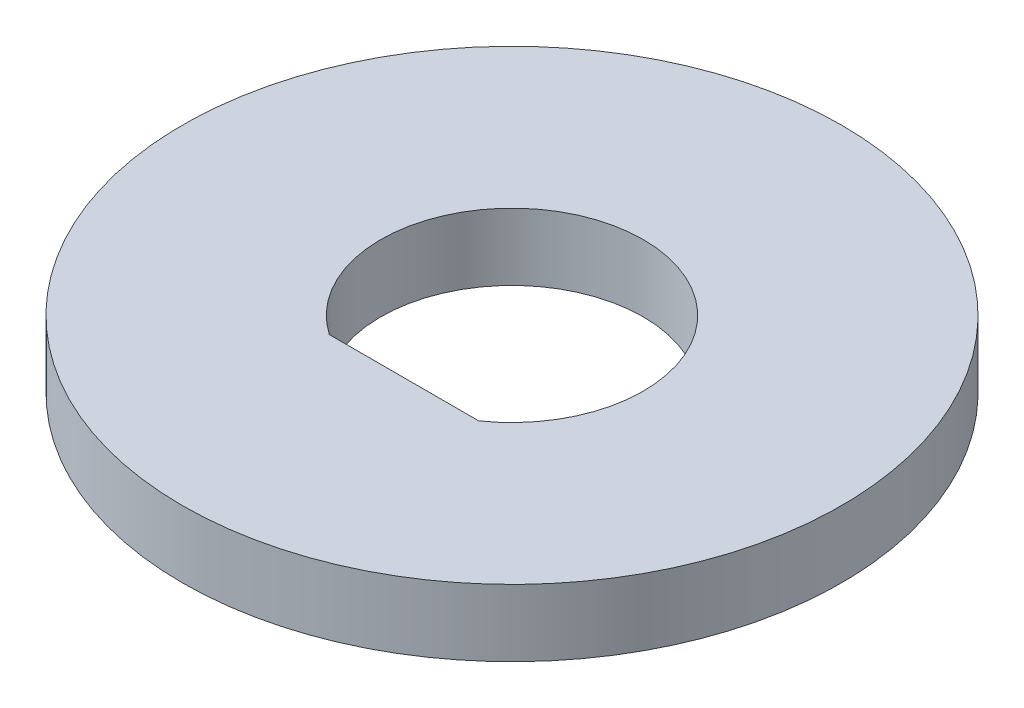
ISO-10303-21;
HEADER;
FILE_DESCRIPTION(('STEP AP214'),'2;1');
FILE_NAME('part.step','',(''),(''),'','','');
FILE_SCHEMA(('AUTOMOTIVE_DESIGN { 1 0 10303 214 1 1 1 1 }'));
ENDSEC;
DATA;
#1=APPLICATION_CONTEXT('core data for automotive mechanical design processes');
#2=APPLICATION_PROTOCOL_DEFINITION('international standard','automotive_design',2000,#1);
#3=PRODUCT_CONTEXT('',#1,'mechanical');
#4=PRODUCT('Part','Part','',(#3));
#5=PRODUCT_RELATED_PRODUCT_CATEGORY('part','',(#4));
#6=PRODUCT_DEFINITION_FORMATION('','',#4);
#7=PRODUCT_DEFINITION_CONTEXT('part definition',#1,'design');
#8=PRODUCT_DEFINITION('design','',#6,#7);
#9=PRODUCT_DEFINITION_SHAPE('','',#8);
#10=(LENGTH_UNIT() NAMED_UNIT(*) SI_UNIT(.MILLI.,.METRE.));
#11=(NAMED_UNIT(*) PLANE_ANGLE_UNIT() SI_UNIT($,.RADIAN.));
#12=(NAMED_UNIT(*) SI_UNIT($,.STERADIAN.) SOLID_ANGLE_UNIT());
#13=UNCERTAINTY_MEASURE_WITH_UNIT(LENGTH_MEASURE(1.E-05),#10,'distance_accuracy_value','');
#14=(GEOMETRIC_REPRESENTATION_CONTEXT(3) GLOBAL_UNCERTAINTY_ASSIGNED_CONTEXT((#13)) GLOBAL_UNIT_ASSIGNED_CONTEXT((#10,
#11,#12)) REPRESENTATION_CONTEXT('',''));
#15=CARTESIAN_POINT('',(0.,0.,0.));
#16=DIRECTION('',(0.,0.,1.));
#17=DIRECTION('',(1.,0.,0.));
#18=AXIS2_PLACEMENT_3D('',#15,#16,#17);
#19=CARTESIAN_POINT('',(0.,2.6,0.));
#20=DIRECTION('',(0.,1.,0.));
#21=DIRECTION('',(0.,0.,1.));
#22=AXIS2_PLACEMENT_3D('',#19,#20,#21);
#23=PLANE('',#22);
#24=CARTESIAN_POINT('',(0.,2.6,0.));
#25=DIRECTION('',(0.,1.,0.));
#26=DIRECTION('',(0.,0.,1.));
#27=AXIS2_PLACEMENT_3D('',#24,#25,#26);
#28=CIRCLE('',#27,12.8);
#29=CARTESIAN_POINT('',(0.,2.6,12.8));
#30=VERTEX_POINT('',#29);
#31=EDGE_CURVE('E11',#30,#30,#28,.T.);
#32=ORIENTED_EDGE('',*,*,#31,.T.);
#33=EDGE_LOOP('',(#32));
#34=FACE_BOUND('',#33,.T.);
#35=DIRECTION('',(1.,0.,0.));
#36=VECTOR('',#35,1.);
#37=CARTESIAN_POINT('',(-2.9,2.6,4.19523539268061));
#38=LINE('',#37,#36);
#39=CARTESIAN_POINT('',(-2.9,2.6,4.19523539268061));
#40=VERTEX_POINT('',#39);
#41=CARTESIAN_POINT('',(2.9,2.6,4.19523539268061));
#42=VERTEX_POINT('',#41);
#43=EDGE_CURVE('E84',#40,#42,#38,.T.);
#44=ORIENTED_EDGE('',*,*,#43,.F.);
#45=CARTESIAN_POINT('',(0.,2.6,0.));
#46=DIRECTION('',(0.,1.,0.));
#47=DIRECTION('',(0.,0.,1.));
#48=AXIS2_PLACEMENT_3D('',#45,#46,#47);
#49=CIRCLE('',#48,5.1);
#50=EDGE_CURVE('E71',#42,#40,#49,.T.);
#51=ORIENTED_EDGE('',*,*,#50,.F.);
#52=EDGE_LOOP('',(#44,#51));
#53=FACE_BOUND('',#52,.T.);
#54=ADVANCED_FACE('F41',(#34,#53),#23,.T.);
#55=CARTESIAN_POINT('',(0.,0.,0.));
#56=DIRECTION('',(0.,1.,0.));
#57=DIRECTION('',(0.,0.,1.));
#58=AXIS2_PLACEMENT_3D('',#55,#56,#57);
#59=PLANE('',#58);
#60=CARTESIAN_POINT('',(0.,0.,0.));
#61=DIRECTION('',(0.,1.,0.));
#62=DIRECTION('',(0.,0.,1.));
#63=AXIS2_PLACEMENT_3D('',#60,#61,#62);
#64=CIRCLE('',#63,12.8);
#65=CARTESIAN_POINT('',(0.,0.,12.8));
#66=VERTEX_POINT('',#65);
#67=EDGE_CURVE('E44',#66,#66,#64,.T.);
#68=ORIENTED_EDGE('',*,*,#67,.F.);
#69=EDGE_LOOP('',(#68));
#70=FACE_BOUND('',#69,.T.);
#71=CARTESIAN_POINT('',(0.,0.,0.));
#72=DIRECTION('',(0.,1.,0.));
#73=DIRECTION('',(0.,0.,1.));
#74=AXIS2_PLACEMENT_3D('',#71,#72,#73);
#75=CIRCLE('',#74,5.1);
#76=CARTESIAN_POINT('',(2.9,0.,4.19523539268061));
#77=VERTEX_POINT('',#76);
#78=CARTESIAN_POINT('',(-2.9,0.,4.19523539268061));
#79=VERTEX_POINT('',#78);
#80=EDGE_CURVE('E62',#77,#79,#75,.T.);
#81=ORIENTED_EDGE('',*,*,#80,.T.);
#82=DIRECTION('',(1.,0.,0.));
#83=VECTOR('',#82,1.);
#84=CARTESIAN_POINT('',(-2.9,0.,4.19523539268061));
#85=LINE('',#84,#83);
#86=EDGE_CURVE('E66',#79,#77,#85,.T.);
#87=ORIENTED_EDGE('',*,*,#86,.T.);
#88=EDGE_LOOP('',(#81,#87));
#89=FACE_BOUND('',#88,.T.);
#90=ADVANCED_FACE('F78',(#70,#89),#59,.F.);
#91=CARTESIAN_POINT('',(0.,2.6,0.));
#92=DIRECTION('',(0.,-1.,0.));
#93=DIRECTION('',(0.,0.,-1.));
#94=AXIS2_PLACEMENT_3D('',#91,#92,#93);
#95=CYLINDRICAL_SURFACE('',#94,12.8);
#96=ORIENTED_EDGE('',*,*,#31,.F.);
#97=EDGE_LOOP('',(#96));
#98=FACE_BOUND('',#97,.T.);
#99=ORIENTED_EDGE('',*,*,#67,.T.);
#100=EDGE_LOOP('',(#99));
#101=FACE_BOUND('',#100,.T.);
#102=ADVANCED_FACE('F43',(#98,#101),#95,.T.);
#103=CARTESIAN_POINT('',(0.,2.6,0.));
#104=DIRECTION('',(0.,-1.,0.));
#105=DIRECTION('',(0.,0.,-1.));
#106=AXIS2_PLACEMENT_3D('',#103,#104,#105);
#107=CYLINDRICAL_SURFACE('',#106,5.1);
#108=ORIENTED_EDGE('',*,*,#80,.F.);
#109=DIRECTION('',(0.,-1.,0.));
#110=VECTOR('',#109,1.);
#111=CARTESIAN_POINT('',(2.9,2.6,4.19523539268061));
#112=LINE('',#111,#110);
#113=EDGE_CURVE('E72',#42,#77,#112,.T.);
#114=ORIENTED_EDGE('',*,*,#113,.F.);
#115=ORIENTED_EDGE('',*,*,#50,.T.);
#116=DIRECTION('',(0.,-1.,0.));
#117=VECTOR('',#116,1.);
#118=CARTESIAN_POINT('',(-2.9,2.6,4.19523539268061));
#119=LINE('',#118,#117);
#120=EDGE_CURVE('E57',#40,#79,#119,.T.);
#121=ORIENTED_EDGE('',*,*,#120,.T.);
#122=EDGE_LOOP('',(#108,#114,#115,#121));
#123=FACE_BOUND('',#122,.T.);
#124=ADVANCED_FACE('F73',(#123),#107,.F.);
#125=CARTESIAN_POINT('',(-2.9,2.6,4.19523539268061));
#126=DIRECTION('',(0.,0.,-1.));
#127=DIRECTION('',(-1.,0.,0.));
#128=AXIS2_PLACEMENT_3D('',#125,#126,#127);
#129=PLANE('',#128);
#130=ORIENTED_EDGE('',*,*,#86,.F.);
#131=ORIENTED_EDGE('',*,*,#120,.F.);
#132=ORIENTED_EDGE('',*,*,#43,.T.);
#133=ORIENTED_EDGE('',*,*,#113,.T.);
#134=EDGE_LOOP('',(#130,#131,#132,#133));
#135=FACE_BOUND('',#134,.T.);
#136=ADVANCED_FACE('F68',(#135),#129,.T.);
#137=CLOSED_SHELL('',(#54,#90,#102,#124,#136));
#138=MANIFOLD_SOLID_BREP('B2',#137);
#139=ADVANCED_BREP_SHAPE_REPRESENTATION('',(#18,#138),#14);
#140=SHAPE_DEFINITION_REPRESENTATION(#9,#139);
ENDSEC;
END-ISO-10303-21;
